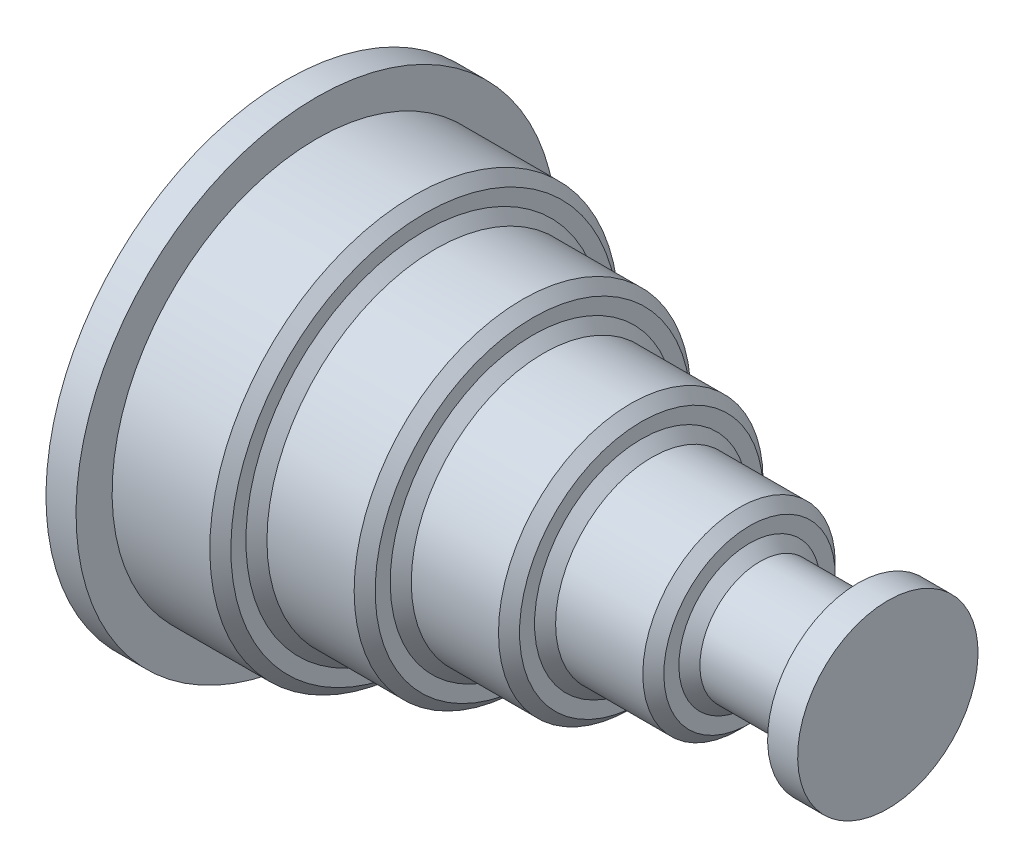
ISO-10303-21;
HEADER;
FILE_DESCRIPTION(('STEP AP214'),'2;1');
FILE_NAME('part.step','',(''),(''),'','','');
FILE_SCHEMA(('AUTOMOTIVE_DESIGN { 1 0 10303 214 1 1 1 1 }'));
ENDSEC;
DATA;
#1=APPLICATION_CONTEXT('core data for automotive mechanical design processes');
#2=APPLICATION_PROTOCOL_DEFINITION('international standard','automotive_design',2000,#1);
#3=PRODUCT_CONTEXT('',#1,'mechanical');
#4=PRODUCT('Part','Part','',(#3));
#5=PRODUCT_RELATED_PRODUCT_CATEGORY('part','',(#4));
#6=PRODUCT_DEFINITION_FORMATION('','',#4);
#7=PRODUCT_DEFINITION_CONTEXT('part definition',#1,'design');
#8=PRODUCT_DEFINITION('design','',#6,#7);
#9=PRODUCT_DEFINITION_SHAPE('','',#8);
#10=(LENGTH_UNIT() NAMED_UNIT(*) SI_UNIT(.MILLI.,.METRE.));
#11=(NAMED_UNIT(*) PLANE_ANGLE_UNIT() SI_UNIT($,.RADIAN.));
#12=(NAMED_UNIT(*) SI_UNIT($,.STERADIAN.) SOLID_ANGLE_UNIT());
#13=UNCERTAINTY_MEASURE_WITH_UNIT(LENGTH_MEASURE(1.E-05),#10,'distance_accuracy_value','');
#14=(GEOMETRIC_REPRESENTATION_CONTEXT(3) GLOBAL_UNCERTAINTY_ASSIGNED_CONTEXT((#13)) GLOBAL_UNIT_ASSIGNED_CONTEXT((#10,
#11,#12)) REPRESENTATION_CONTEXT('',''));
#15=CARTESIAN_POINT('',(0.,0.,0.));
#16=DIRECTION('',(0.,0.,1.));
#17=DIRECTION('',(1.,0.,0.));
#18=AXIS2_PLACEMENT_3D('',#15,#16,#17);
#19=CARTESIAN_POINT('',(0.,0.,0.));
#20=DIRECTION('',(-1.,0.,0.));
#21=DIRECTION('',(0.,-1.,0.));
#22=AXIS2_PLACEMENT_3D('',#19,#20,#21);
#23=PLANE('',#22);
#24=CARTESIAN_POINT('',(0.,0.,0.));
#25=DIRECTION('',(1.,0.,0.));
#26=DIRECTION('',(0.,1.,0.));
#27=AXIS2_PLACEMENT_3D('',#24,#25,#26);
#28=CIRCLE('',#27,8.);
#29=CARTESIAN_POINT('',(0.,8.,0.));
#30=VERTEX_POINT('',#29);
#31=EDGE_CURVE('E87',#30,#30,#28,.T.);
#32=ORIENTED_EDGE('',*,*,#31,.F.);
#33=EDGE_LOOP('',(#32));
#34=FACE_BOUND('',#33,.T.);
#35=ADVANCED_FACE('F31',(#34),#23,.T.);
#36=CARTESIAN_POINT('',(20.,0.,0.));
#37=DIRECTION('',(1.,0.,0.));
#38=DIRECTION('',(0.,1.,0.));
#39=AXIS2_PLACEMENT_3D('',#36,#37,#38);
#40=CYLINDRICAL_SURFACE('',#39,8.);
#41=ORIENTED_EDGE('',*,*,#31,.T.);
#42=EDGE_LOOP('',(#41));
#43=FACE_BOUND('',#42,.T.);
#44=CARTESIAN_POINT('',(1.,0.,0.));
#45=DIRECTION('',(1.,0.,0.));
#46=DIRECTION('',(0.,1.,0.));
#47=AXIS2_PLACEMENT_3D('',#44,#45,#46);
#48=CIRCLE('',#47,8.);
#49=CARTESIAN_POINT('',(1.,8.,0.));
#50=VERTEX_POINT('',#49);
#51=EDGE_CURVE('E90',#50,#50,#48,.T.);
#52=ORIENTED_EDGE('',*,*,#51,.F.);
#53=EDGE_LOOP('',(#52));
#54=FACE_BOUND('',#53,.T.);
#55=ADVANCED_FACE('F123',(#43,#54),#40,.T.);
#56=CARTESIAN_POINT('',(1.,8.,0.));
#57=DIRECTION('',(1.,0.,0.));
#58=DIRECTION('',(0.,1.,0.));
#59=AXIS2_PLACEMENT_3D('',#56,#57,#58);
#60=PLANE('',#59);
#61=ORIENTED_EDGE('',*,*,#51,.T.);
#62=EDGE_LOOP('',(#61));
#63=FACE_BOUND('',#62,.T.);
#64=CARTESIAN_POINT('',(1.,0.,0.));
#65=DIRECTION('',(1.,0.,0.));
#66=DIRECTION('',(0.,1.,0.));
#67=AXIS2_PLACEMENT_3D('',#64,#65,#66);
#68=CIRCLE('',#67,6.8);
#69=CARTESIAN_POINT('',(1.,6.8,0.));
#70=VERTEX_POINT('',#69);
#71=EDGE_CURVE('E93',#70,#70,#68,.T.);
#72=ORIENTED_EDGE('',*,*,#71,.F.);
#73=EDGE_LOOP('',(#72));
#74=FACE_BOUND('',#73,.T.);
#75=ADVANCED_FACE('F129',(#63,#74),#60,.T.);
#76=CARTESIAN_POINT('',(20.,0.,0.));
#77=DIRECTION('',(1.,0.,0.));
#78=DIRECTION('',(0.,1.,0.));
#79=AXIS2_PLACEMENT_3D('',#76,#77,#78);
#80=CYLINDRICAL_SURFACE('',#79,6.8);
#81=CARTESIAN_POINT('',(4.25,0.,0.));
#82=DIRECTION('',(1.,0.,0.));
#83=DIRECTION('',(0.,1.,0.));
#84=AXIS2_PLACEMENT_3D('',#81,#82,#83);
#85=CIRCLE('',#84,6.8);
#86=CARTESIAN_POINT('',(4.25,6.8,0.));
#87=VERTEX_POINT('',#86);
#88=EDGE_CURVE('E10',#87,#87,#85,.F.);
#89=ORIENTED_EDGE('',*,*,#88,.T.);
#90=EDGE_LOOP('',(#89));
#91=FACE_BOUND('',#90,.T.);
#92=ORIENTED_EDGE('',*,*,#71,.T.);
#93=EDGE_LOOP('',(#92));
#94=FACE_BOUND('',#93,.T.);
#95=ADVANCED_FACE('F188',(#91,#94),#80,.T.);
#96=CARTESIAN_POINT('',(4.6,6.8,0.));
#97=DIRECTION('',(1.,0.,0.));
#98=DIRECTION('',(0.,1.,0.));
#99=AXIS2_PLACEMENT_3D('',#96,#97,#98);
#100=PLANE('',#99);
#101=CARTESIAN_POINT('',(4.6,0.,0.));
#102=DIRECTION('',(1.,0.,0.));
#103=DIRECTION('',(0.,1.,0.));
#104=AXIS2_PLACEMENT_3D('',#101,#102,#103);
#105=CIRCLE('',#104,5.95000000000001);
#106=CARTESIAN_POINT('',(4.6,-5.95000000000001,0.));
#107=VERTEX_POINT('',#106);
#108=EDGE_CURVE('E38',#107,#107,#105,.F.);
#109=ORIENTED_EDGE('',*,*,#108,.T.);
#110=EDGE_LOOP('',(#109));
#111=FACE_BOUND('',#110,.T.);
#112=CARTESIAN_POINT('',(4.6,0.,0.));
#113=DIRECTION('',(1.,0.,0.));
#114=DIRECTION('',(0.,1.,0.));
#115=AXIS2_PLACEMENT_3D('',#112,#113,#114);
#116=CIRCLE('',#115,6.45000000000001);
#117=CARTESIAN_POINT('',(4.6,6.45000000000001,0.));
#118=VERTEX_POINT('',#117);
#119=EDGE_CURVE('E42',#118,#118,#116,.T.);
#120=ORIENTED_EDGE('',*,*,#119,.T.);
#121=EDGE_LOOP('',(#120));
#122=FACE_BOUND('',#121,.T.);
#123=ADVANCED_FACE('F181',(#111,#122),#100,.T.);
#124=CARTESIAN_POINT('',(20.,0.,0.));
#125=DIRECTION('',(1.,0.,0.));
#126=DIRECTION('',(0.,1.,0.));
#127=AXIS2_PLACEMENT_3D('',#124,#125,#126);
#128=CYLINDRICAL_SURFACE('',#127,5.6);
#129=CARTESIAN_POINT('',(4.95000000000001,0.,0.));
#130=DIRECTION('',(1.,0.,0.));
#131=DIRECTION('',(0.,1.,0.));
#132=AXIS2_PLACEMENT_3D('',#129,#130,#131);
#133=CIRCLE('',#132,5.6);
#134=CARTESIAN_POINT('',(4.95000000000001,-5.6,0.));
#135=VERTEX_POINT('',#134);
#136=EDGE_CURVE('E46',#135,#135,#133,.T.);
#137=ORIENTED_EDGE('',*,*,#136,.T.);
#138=EDGE_LOOP('',(#137));
#139=FACE_BOUND('',#138,.T.);
#140=CARTESIAN_POINT('',(7.85,0.,0.));
#141=DIRECTION('',(1.,0.,0.));
#142=DIRECTION('',(0.,1.,0.));
#143=AXIS2_PLACEMENT_3D('',#140,#141,#142);
#144=CIRCLE('',#143,5.6);
#145=CARTESIAN_POINT('',(7.85,5.6,0.));
#146=VERTEX_POINT('',#145);
#147=EDGE_CURVE('E51',#146,#146,#144,.F.);
#148=ORIENTED_EDGE('',*,*,#147,.T.);
#149=EDGE_LOOP('',(#148));
#150=FACE_BOUND('',#149,.T.);
#151=ADVANCED_FACE('F171',(#139,#150),#128,.T.);
#152=CARTESIAN_POINT('',(8.2,5.6,0.));
#153=DIRECTION('',(1.,0.,0.));
#154=DIRECTION('',(0.,1.,0.));
#155=AXIS2_PLACEMENT_3D('',#152,#153,#154);
#156=PLANE('',#155);
#157=CARTESIAN_POINT('',(8.2,0.,0.));
#158=DIRECTION('',(1.,0.,0.));
#159=DIRECTION('',(0.,1.,0.));
#160=AXIS2_PLACEMENT_3D('',#157,#158,#159);
#161=CIRCLE('',#160,4.75);
#162=CARTESIAN_POINT('',(8.2,4.75,0.));
#163=VERTEX_POINT('',#162);
#164=EDGE_CURVE('E54',#163,#163,#161,.F.);
#165=ORIENTED_EDGE('',*,*,#164,.T.);
#166=EDGE_LOOP('',(#165));
#167=FACE_BOUND('',#166,.T.);
#168=CARTESIAN_POINT('',(8.2,0.,0.));
#169=DIRECTION('',(1.,0.,0.));
#170=DIRECTION('',(0.,1.,0.));
#171=AXIS2_PLACEMENT_3D('',#168,#169,#170);
#172=CIRCLE('',#171,5.25);
#173=CARTESIAN_POINT('',(8.2,5.25,0.));
#174=VERTEX_POINT('',#173);
#175=EDGE_CURVE('E57',#174,#174,#172,.T.);
#176=ORIENTED_EDGE('',*,*,#175,.T.);
#177=EDGE_LOOP('',(#176));
#178=FACE_BOUND('',#177,.T.);
#179=ADVANCED_FACE('F168',(#167,#178),#156,.T.);
#180=CARTESIAN_POINT('',(20.,0.,0.));
#181=DIRECTION('',(1.,0.,0.));
#182=DIRECTION('',(0.,1.,0.));
#183=AXIS2_PLACEMENT_3D('',#180,#181,#182);
#184=CYLINDRICAL_SURFACE('',#183,4.4);
#185=CARTESIAN_POINT('',(8.55000000000001,0.,0.));
#186=DIRECTION('',(1.,0.,0.));
#187=DIRECTION('',(0.,1.,0.));
#188=AXIS2_PLACEMENT_3D('',#185,#186,#187);
#189=CIRCLE('',#188,4.4);
#190=CARTESIAN_POINT('',(8.55000000000001,4.4,0.));
#191=VERTEX_POINT('',#190);
#192=EDGE_CURVE('E60',#191,#191,#189,.T.);
#193=ORIENTED_EDGE('',*,*,#192,.T.);
#194=EDGE_LOOP('',(#193));
#195=FACE_BOUND('',#194,.T.);
#196=CARTESIAN_POINT('',(11.45,0.,0.));
#197=DIRECTION('',(1.,0.,0.));
#198=DIRECTION('',(0.,1.,0.));
#199=AXIS2_PLACEMENT_3D('',#196,#197,#198);
#200=CIRCLE('',#199,4.4);
#201=CARTESIAN_POINT('',(11.45,4.4,0.));
#202=VERTEX_POINT('',#201);
#203=EDGE_CURVE('E63',#202,#202,#200,.F.);
#204=ORIENTED_EDGE('',*,*,#203,.T.);
#205=EDGE_LOOP('',(#204));
#206=FACE_BOUND('',#205,.T.);
#207=ADVANCED_FACE('F170',(#195,#206),#184,.T.);
#208=CARTESIAN_POINT('',(11.8,4.4,0.));
#209=DIRECTION('',(1.,0.,0.));
#210=DIRECTION('',(0.,1.,0.));
#211=AXIS2_PLACEMENT_3D('',#208,#209,#210);
#212=PLANE('',#211);
#213=CARTESIAN_POINT('',(11.8,0.,0.));
#214=DIRECTION('',(1.,0.,0.));
#215=DIRECTION('',(0.,1.,0.));
#216=AXIS2_PLACEMENT_3D('',#213,#214,#215);
#217=CIRCLE('',#216,3.55);
#218=CARTESIAN_POINT('',(11.8,3.55,0.));
#219=VERTEX_POINT('',#218);
#220=EDGE_CURVE('E66',#219,#219,#217,.F.);
#221=ORIENTED_EDGE('',*,*,#220,.T.);
#222=EDGE_LOOP('',(#221));
#223=FACE_BOUND('',#222,.T.);
#224=CARTESIAN_POINT('',(11.8,0.,0.));
#225=DIRECTION('',(1.,0.,0.));
#226=DIRECTION('',(0.,1.,0.));
#227=AXIS2_PLACEMENT_3D('',#224,#225,#226);
#228=CIRCLE('',#227,4.05);
#229=CARTESIAN_POINT('',(11.8,4.05,0.));
#230=VERTEX_POINT('',#229);
#231=EDGE_CURVE('E69',#230,#230,#228,.T.);
#232=ORIENTED_EDGE('',*,*,#231,.T.);
#233=EDGE_LOOP('',(#232));
#234=FACE_BOUND('',#233,.T.);
#235=ADVANCED_FACE('F178',(#223,#234),#212,.T.);
#236=CARTESIAN_POINT('',(20.,0.,0.));
#237=DIRECTION('',(1.,0.,0.));
#238=DIRECTION('',(0.,1.,0.));
#239=AXIS2_PLACEMENT_3D('',#236,#237,#238);
#240=CYLINDRICAL_SURFACE('',#239,3.2);
#241=CARTESIAN_POINT('',(12.15,0.,0.));
#242=DIRECTION('',(1.,0.,0.));
#243=DIRECTION('',(0.,1.,0.));
#244=AXIS2_PLACEMENT_3D('',#241,#242,#243);
#245=CIRCLE('',#244,3.2);
#246=CARTESIAN_POINT('',(12.15,3.2,0.));
#247=VERTEX_POINT('',#246);
#248=EDGE_CURVE('E72',#247,#247,#245,.T.);
#249=ORIENTED_EDGE('',*,*,#248,.T.);
#250=EDGE_LOOP('',(#249));
#251=FACE_BOUND('',#250,.T.);
#252=CARTESIAN_POINT('',(15.05,0.,0.));
#253=DIRECTION('',(1.,0.,0.));
#254=DIRECTION('',(0.,1.,0.));
#255=AXIS2_PLACEMENT_3D('',#252,#253,#254);
#256=CIRCLE('',#255,3.2);
#257=CARTESIAN_POINT('',(15.05,3.2,0.));
#258=VERTEX_POINT('',#257);
#259=EDGE_CURVE('E75',#258,#258,#256,.F.);
#260=ORIENTED_EDGE('',*,*,#259,.T.);
#261=EDGE_LOOP('',(#260));
#262=FACE_BOUND('',#261,.T.);
#263=ADVANCED_FACE('F234',(#251,#262),#240,.T.);
#264=CARTESIAN_POINT('',(15.4,3.2,0.));
#265=DIRECTION('',(1.,0.,0.));
#266=DIRECTION('',(0.,1.,0.));
#267=AXIS2_PLACEMENT_3D('',#264,#265,#266);
#268=PLANE('',#267);
#269=CARTESIAN_POINT('',(15.4,0.,0.));
#270=DIRECTION('',(1.,0.,0.));
#271=DIRECTION('',(0.,1.,0.));
#272=AXIS2_PLACEMENT_3D('',#269,#270,#271);
#273=CIRCLE('',#272,2.35000000000001);
#274=CARTESIAN_POINT('',(15.4,2.35000000000001,0.));
#275=VERTEX_POINT('',#274);
#276=EDGE_CURVE('E78',#275,#275,#273,.F.);
#277=ORIENTED_EDGE('',*,*,#276,.T.);
#278=EDGE_LOOP('',(#277));
#279=FACE_BOUND('',#278,.T.);
#280=CARTESIAN_POINT('',(15.4,0.,0.));
#281=DIRECTION('',(1.,0.,0.));
#282=DIRECTION('',(0.,1.,0.));
#283=AXIS2_PLACEMENT_3D('',#280,#281,#282);
#284=CIRCLE('',#283,2.84999999999999);
#285=CARTESIAN_POINT('',(15.4,2.85,0.));
#286=VERTEX_POINT('',#285);
#287=EDGE_CURVE('E81',#286,#286,#284,.T.);
#288=ORIENTED_EDGE('',*,*,#287,.T.);
#289=EDGE_LOOP('',(#288));
#290=FACE_BOUND('',#289,.T.);
#291=ADVANCED_FACE('F243',(#279,#290),#268,.T.);
#292=CARTESIAN_POINT('',(20.,0.,0.));
#293=DIRECTION('',(1.,0.,0.));
#294=DIRECTION('',(0.,1.,0.));
#295=AXIS2_PLACEMENT_3D('',#292,#293,#294);
#296=CYLINDRICAL_SURFACE('',#295,2.);
#297=CARTESIAN_POINT('',(15.75,0.,0.));
#298=DIRECTION('',(1.,0.,0.));
#299=DIRECTION('',(0.,1.,0.));
#300=AXIS2_PLACEMENT_3D('',#297,#298,#299);
#301=CIRCLE('',#300,2.);
#302=CARTESIAN_POINT('',(15.75,2.,0.));
#303=VERTEX_POINT('',#302);
#304=EDGE_CURVE('E84',#303,#303,#301,.T.);
#305=ORIENTED_EDGE('',*,*,#304,.T.);
#306=EDGE_LOOP('',(#305));
#307=FACE_BOUND('',#306,.T.);
#308=CARTESIAN_POINT('',(19.,0.,0.));
#309=DIRECTION('',(1.,0.,0.));
#310=DIRECTION('',(0.,1.,0.));
#311=AXIS2_PLACEMENT_3D('',#308,#309,#310);
#312=CIRCLE('',#311,2.);
#313=CARTESIAN_POINT('',(19.,2.,0.));
#314=VERTEX_POINT('',#313);
#315=EDGE_CURVE('E96',#314,#314,#312,.T.);
#316=ORIENTED_EDGE('',*,*,#315,.F.);
#317=EDGE_LOOP('',(#316));
#318=FACE_BOUND('',#317,.T.);
#319=ADVANCED_FACE('F119',(#307,#318),#296,.T.);
#320=CARTESIAN_POINT('',(19.,2.,0.));
#321=DIRECTION('',(-1.,0.,0.));
#322=DIRECTION('',(0.,-1.,0.));
#323=AXIS2_PLACEMENT_3D('',#320,#321,#322);
#324=PLANE('',#323);
#325=ORIENTED_EDGE('',*,*,#315,.T.);
#326=EDGE_LOOP('',(#325));
#327=FACE_BOUND('',#326,.T.);
#328=CARTESIAN_POINT('',(19.,0.,0.));
#329=DIRECTION('',(1.,0.,0.));
#330=DIRECTION('',(0.,1.,0.));
#331=AXIS2_PLACEMENT_3D('',#328,#329,#330);
#332=CIRCLE('',#331,3.);
#333=CARTESIAN_POINT('',(19.,3.,0.));
#334=VERTEX_POINT('',#333);
#335=EDGE_CURVE('E99',#334,#334,#332,.T.);
#336=ORIENTED_EDGE('',*,*,#335,.F.);
#337=EDGE_LOOP('',(#336));
#338=FACE_BOUND('',#337,.T.);
#339=ADVANCED_FACE('F110',(#327,#338),#324,.T.);
#340=CARTESIAN_POINT('',(20.,0.,0.));
#341=DIRECTION('',(1.,0.,0.));
#342=DIRECTION('',(0.,1.,0.));
#343=AXIS2_PLACEMENT_3D('',#340,#341,#342);
#344=CYLINDRICAL_SURFACE('',#343,3.);
#345=ORIENTED_EDGE('',*,*,#335,.T.);
#346=EDGE_LOOP('',(#345));
#347=FACE_BOUND('',#346,.T.);
#348=CARTESIAN_POINT('',(20.,0.,0.));
#349=DIRECTION('',(1.,0.,0.));
#350=DIRECTION('',(0.,1.,0.));
#351=AXIS2_PLACEMENT_3D('',#348,#349,#350);
#352=CIRCLE('',#351,3.);
#353=CARTESIAN_POINT('',(20.,3.,0.));
#354=VERTEX_POINT('',#353);
#355=EDGE_CURVE('E102',#354,#354,#352,.T.);
#356=ORIENTED_EDGE('',*,*,#355,.F.);
#357=EDGE_LOOP('',(#356));
#358=FACE_BOUND('',#357,.T.);
#359=ADVANCED_FACE('F108',(#347,#358),#344,.T.);
#360=CARTESIAN_POINT('',(20.,3.,0.));
#361=DIRECTION('',(1.,0.,0.));
#362=DIRECTION('',(0.,1.,0.));
#363=AXIS2_PLACEMENT_3D('',#360,#361,#362);
#364=PLANE('',#363);
#365=ORIENTED_EDGE('',*,*,#355,.T.);
#366=EDGE_LOOP('',(#365));
#367=FACE_BOUND('',#366,.T.);
#368=ADVANCED_FACE('F106',(#367),#364,.T.);
#369=CARTESIAN_POINT('',(15.75,0.,0.));
#370=DIRECTION('',(-1.,0.,0.));
#371=DIRECTION('',(0.,-1.,0.));
#372=AXIS2_PLACEMENT_3D('',#369,#370,#371);
#373=CONICAL_SURFACE('',#372,2.,0.785398163397443);
#374=ORIENTED_EDGE('',*,*,#276,.F.);
#375=EDGE_LOOP('',(#374));
#376=FACE_BOUND('',#375,.T.);
#377=ORIENTED_EDGE('',*,*,#304,.F.);
#378=EDGE_LOOP('',(#377));
#379=FACE_BOUND('',#378,.T.);
#380=ADVANCED_FACE('F117',(#376,#379),#373,.T.);
#381=CARTESIAN_POINT('',(12.15,0.,0.));
#382=DIRECTION('',(-1.,0.,0.));
#383=DIRECTION('',(0.,-1.,0.));
#384=AXIS2_PLACEMENT_3D('',#381,#382,#383);
#385=CONICAL_SURFACE('',#384,3.2,0.785398163397443);
#386=ORIENTED_EDGE('',*,*,#220,.F.);
#387=EDGE_LOOP('',(#386));
#388=FACE_BOUND('',#387,.T.);
#389=ORIENTED_EDGE('',*,*,#248,.F.);
#390=EDGE_LOOP('',(#389));
#391=FACE_BOUND('',#390,.T.);
#392=ADVANCED_FACE('F137',(#388,#391),#385,.T.);
#393=CARTESIAN_POINT('',(8.55000000000001,0.,0.));
#394=DIRECTION('',(-1.,0.,0.));
#395=DIRECTION('',(0.,-1.,0.));
#396=AXIS2_PLACEMENT_3D('',#393,#394,#395);
#397=CONICAL_SURFACE('',#396,4.4,0.78539816339744);
#398=ORIENTED_EDGE('',*,*,#164,.F.);
#399=EDGE_LOOP('',(#398));
#400=FACE_BOUND('',#399,.T.);
#401=ORIENTED_EDGE('',*,*,#192,.F.);
#402=EDGE_LOOP('',(#401));
#403=FACE_BOUND('',#402,.T.);
#404=ADVANCED_FACE('F141',(#400,#403),#397,.T.);
#405=CARTESIAN_POINT('',(4.95000000000001,0.,0.));
#406=DIRECTION('',(-1.,0.,0.));
#407=DIRECTION('',(0.,-1.,0.));
#408=AXIS2_PLACEMENT_3D('',#405,#406,#407);
#409=CONICAL_SURFACE('',#408,5.6,0.785398163397447);
#410=CARTESIAN_POINT('',(4.6,-5.95000000000001,0.));
#411=CARTESIAN_POINT('',(4.60364583333333,-5.94635416666668,0.));
#412=CARTESIAN_POINT('',(4.60729166666667,-5.94270833333334,0.));
#413=CARTESIAN_POINT('',(4.61458333333333,-5.93541666666668,0.));
#414=CARTESIAN_POINT('',(4.61822916666667,-5.93177083333334,0.));
#415=CARTESIAN_POINT('',(4.62552083333334,-5.92447916666667,0.));
#416=CARTESIAN_POINT('',(4.62916666666667,-5.92083333333334,0.));
#417=CARTESIAN_POINT('',(4.63645833333334,-5.91354166666668,0.));
#418=CARTESIAN_POINT('',(4.64010416666667,-5.90989583333334,0.));
#419=CARTESIAN_POINT('',(4.64739583333334,-5.90260416666668,0.));
#420=CARTESIAN_POINT('',(4.65104166666667,-5.89895833333334,0.));
#421=CARTESIAN_POINT('',(4.65833333333334,-5.89166666666667,0.));
#422=CARTESIAN_POINT('',(4.66197916666667,-5.88802083333334,0.));
#423=CARTESIAN_POINT('',(4.66927083333334,-5.88072916666667,0.));
#424=CARTESIAN_POINT('',(4.67291666666667,-5.87708333333334,0.));
#425=CARTESIAN_POINT('',(4.68020833333334,-5.86979166666667,0.));
#426=CARTESIAN_POINT('',(4.68385416666667,-5.86614583333334,0.));
#427=CARTESIAN_POINT('',(4.69114583333334,-5.85885416666667,0.));
#428=CARTESIAN_POINT('',(4.69479166666667,-5.85520833333334,0.));
#429=CARTESIAN_POINT('',(4.70208333333334,-5.84791666666667,0.));
#430=CARTESIAN_POINT('',(4.70572916666667,-5.84427083333334,0.));
#431=CARTESIAN_POINT('',(4.71302083333334,-5.83697916666667,0.));
#432=CARTESIAN_POINT('',(4.71666666666667,-5.83333333333334,0.));
#433=CARTESIAN_POINT('',(4.72395833333334,-5.82604166666667,0.));
#434=CARTESIAN_POINT('',(4.72760416666667,-5.82239583333334,0.));
#435=CARTESIAN_POINT('',(4.73489583333334,-5.81510416666667,0.));
#436=CARTESIAN_POINT('',(4.73854166666667,-5.81145833333334,0.));
#437=CARTESIAN_POINT('',(4.74583333333334,-5.80416666666667,0.));
#438=CARTESIAN_POINT('',(4.74947916666667,-5.80052083333334,0.));
#439=CARTESIAN_POINT('',(4.75677083333334,-5.79322916666667,0.));
#440=CARTESIAN_POINT('',(4.76041666666667,-5.78958333333334,0.));
#441=CARTESIAN_POINT('',(4.76770833333334,-5.78229166666667,0.));
#442=CARTESIAN_POINT('',(4.77135416666667,-5.77864583333334,0.));
#443=CARTESIAN_POINT('',(4.77864583333334,-5.77135416666667,0.));
#444=CARTESIAN_POINT('',(4.78229166666667,-5.76770833333334,0.));
#445=CARTESIAN_POINT('',(4.78958333333334,-5.76041666666667,0.));
#446=CARTESIAN_POINT('',(4.79322916666667,-5.75677083333334,0.));
#447=CARTESIAN_POINT('',(4.80052083333334,-5.74947916666667,0.));
#448=CARTESIAN_POINT('',(4.80416666666667,-5.74583333333334,0.));
#449=CARTESIAN_POINT('',(4.81145833333334,-5.73854166666667,0.));
#450=CARTESIAN_POINT('',(4.81510416666667,-5.73489583333334,0.));
#451=CARTESIAN_POINT('',(4.82239583333334,-5.72760416666667,0.));
#452=CARTESIAN_POINT('',(4.82604166666667,-5.72395833333334,0.));
#453=CARTESIAN_POINT('',(4.83333333333334,-5.71666666666667,0.));
#454=CARTESIAN_POINT('',(4.83697916666667,-5.71302083333334,0.));
#455=CARTESIAN_POINT('',(4.84427083333334,-5.70572916666667,0.));
#456=CARTESIAN_POINT('',(4.84791666666667,-5.70208333333334,0.));
#457=CARTESIAN_POINT('',(4.85520833333334,-5.69479166666667,0.));
#458=CARTESIAN_POINT('',(4.85885416666668,-5.69114583333334,0.));
#459=CARTESIAN_POINT('',(4.86614583333334,-5.68385416666667,0.));
#460=CARTESIAN_POINT('',(4.86979166666667,-5.68020833333334,0.));
#461=CARTESIAN_POINT('',(4.87708333333334,-5.67291666666667,0.));
#462=CARTESIAN_POINT('',(4.88072916666667,-5.66927083333334,0.));
#463=CARTESIAN_POINT('',(4.88802083333334,-5.66197916666667,0.));
#464=CARTESIAN_POINT('',(4.89166666666668,-5.65833333333334,0.));
#465=CARTESIAN_POINT('',(4.89895833333334,-5.65104166666667,0.));
#466=CARTESIAN_POINT('',(4.90260416666668,-5.64739583333334,0.));
#467=CARTESIAN_POINT('',(4.90989583333334,-5.64010416666667,0.));
#468=CARTESIAN_POINT('',(4.91354166666668,-5.63645833333334,0.));
#469=CARTESIAN_POINT('',(4.92083333333334,-5.62916666666667,0.));
#470=CARTESIAN_POINT('',(4.92447916666668,-5.62552083333334,0.));
#471=CARTESIAN_POINT('',(4.93177083333334,-5.61822916666667,0.));
#472=CARTESIAN_POINT('',(4.93541666666668,-5.61458333333333,0.));
#473=CARTESIAN_POINT('',(4.94270833333334,-5.60729166666667,0.));
#474=CARTESIAN_POINT('',(4.94635416666668,-5.60364583333333,0.));
#475=CARTESIAN_POINT('',(4.95000000000001,-5.6,0.));
#476=B_SPLINE_CURVE_WITH_KNOTS('',3,(#410,#411,#412,#413,#414,#415,#416,#417,#418,#419,#420,
#421,#422,#423,#424,#425,#426,#427,#428,#429,#430,#431,#432,#433,#434,#435,#436,#437,#438,#439,
#440,#441,#442,#443,#444,#445,#446,#447,#448,#449,#450,#451,#452,#453,#454,#455,#456,#457,#458,
#459,#460,#461,#462,#463,#464,#465,#466,#467,#468,#469,#470,#471,#472,#473,#474,#475),
.UNSPECIFIED.,.F.,.F.,(4,2,2,2,2,2,2,2,2,2,2,2,2,2,2,2,2,2,2,2,2,2,2,2,2,2,2,2,2,2,2,2,4),(0.,
0.0154679608384565,0.030935921676913,0.0464038825153694,0.0618718433538247,0.0773398041922811,
0.0928077650307376,0.108275725869193,0.123743686707649,0.139211647546106,0.154679608384562,
0.170147569223018,0.185615530061474,0.20108349089993,0.216551451738386,0.232019412576842,
0.247487373415298,0.262955334253755,0.27842329509221,0.293891255930666,0.309359216769123,
0.324827177607579,0.340295138446035,0.355763099284491,0.371231060122947,0.386699020961403,
0.402166981799859,0.417634942638316,0.433102903476772,0.448570864315227,0.464038825153684,
0.47950678599214,0.494974746830597),.UNSPECIFIED.);
#477=EDGE_CURVE('BSEAM145',#107,#135,#476,.T.);
#478=ORIENTED_EDGE('',*,*,#108,.F.);
#479=ORIENTED_EDGE('',*,*,#136,.F.);
#480=ORIENTED_EDGE('',*,*,#477,.T.);
#481=ORIENTED_EDGE('',*,*,#477,.F.);
#482=EDGE_LOOP('',(#478,#480,#479,#481));
#483=FACE_BOUND('',#482,.T.);
#484=ADVANCED_FACE('F145',(#483),#409,.T.);
#485=CARTESIAN_POINT('',(15.4,0.,0.));
#486=DIRECTION('',(-1.,0.,0.));
#487=DIRECTION('',(0.,-1.,0.));
#488=AXIS2_PLACEMENT_3D('',#485,#486,#487);
#489=CONICAL_SURFACE('',#488,2.84999999999999,0.785398163397445);
#490=ORIENTED_EDGE('',*,*,#259,.F.);
#491=EDGE_LOOP('',(#490));
#492=FACE_BOUND('',#491,.T.);
#493=ORIENTED_EDGE('',*,*,#287,.F.);
#494=EDGE_LOOP('',(#493));
#495=FACE_BOUND('',#494,.T.);
#496=ADVANCED_FACE('F149',(#492,#495),#489,.T.);
#497=CARTESIAN_POINT('',(11.8,0.,0.));
#498=DIRECTION('',(-1.,0.,0.));
#499=DIRECTION('',(0.,-1.,0.));
#500=AXIS2_PLACEMENT_3D('',#497,#498,#499);
#501=CONICAL_SURFACE('',#500,4.05,0.785398163397445);
#502=ORIENTED_EDGE('',*,*,#203,.F.);
#503=EDGE_LOOP('',(#502));
#504=FACE_BOUND('',#503,.T.);
#505=ORIENTED_EDGE('',*,*,#231,.F.);
#506=EDGE_LOOP('',(#505));
#507=FACE_BOUND('',#506,.T.);
#508=ADVANCED_FACE('F153',(#504,#507),#501,.T.);
#509=CARTESIAN_POINT('',(8.2,0.,0.));
#510=DIRECTION('',(-1.,0.,0.));
#511=DIRECTION('',(0.,-1.,0.));
#512=AXIS2_PLACEMENT_3D('',#509,#510,#511);
#513=CONICAL_SURFACE('',#512,5.25,0.785398163397445);
#514=ORIENTED_EDGE('',*,*,#147,.F.);
#515=EDGE_LOOP('',(#514));
#516=FACE_BOUND('',#515,.T.);
#517=ORIENTED_EDGE('',*,*,#175,.F.);
#518=EDGE_LOOP('',(#517));
#519=FACE_BOUND('',#518,.T.);
#520=ADVANCED_FACE('F156',(#516,#519),#513,.T.);
#521=CARTESIAN_POINT('',(4.6,0.,0.));
#522=DIRECTION('',(-1.,0.,0.));
#523=DIRECTION('',(0.,-1.,0.));
#524=AXIS2_PLACEMENT_3D('',#521,#522,#523);
#525=CONICAL_SURFACE('',#524,6.45000000000001,0.785398163397446);
#526=ORIENTED_EDGE('',*,*,#88,.F.);
#527=EDGE_LOOP('',(#526));
#528=FACE_BOUND('',#527,.T.);
#529=ORIENTED_EDGE('',*,*,#119,.F.);
#530=EDGE_LOOP('',(#529));
#531=FACE_BOUND('',#530,.T.);
#532=ADVANCED_FACE('F33',(#528,#531),#525,.T.);
#533=CLOSED_SHELL('',(#35,#55,#75,#95,#123,#151,#179,#207,#235,#263,#291,#319,#339,#359,#368,
#380,#392,#404,#484,#496,#508,#520,#532));
#534=MANIFOLD_SOLID_BREP('B2',#533);
#535=ADVANCED_BREP_SHAPE_REPRESENTATION('',(#18,#534),#14);
#536=SHAPE_DEFINITION_REPRESENTATION(#9,#535);
ENDSEC;
END-ISO-10303-21;
